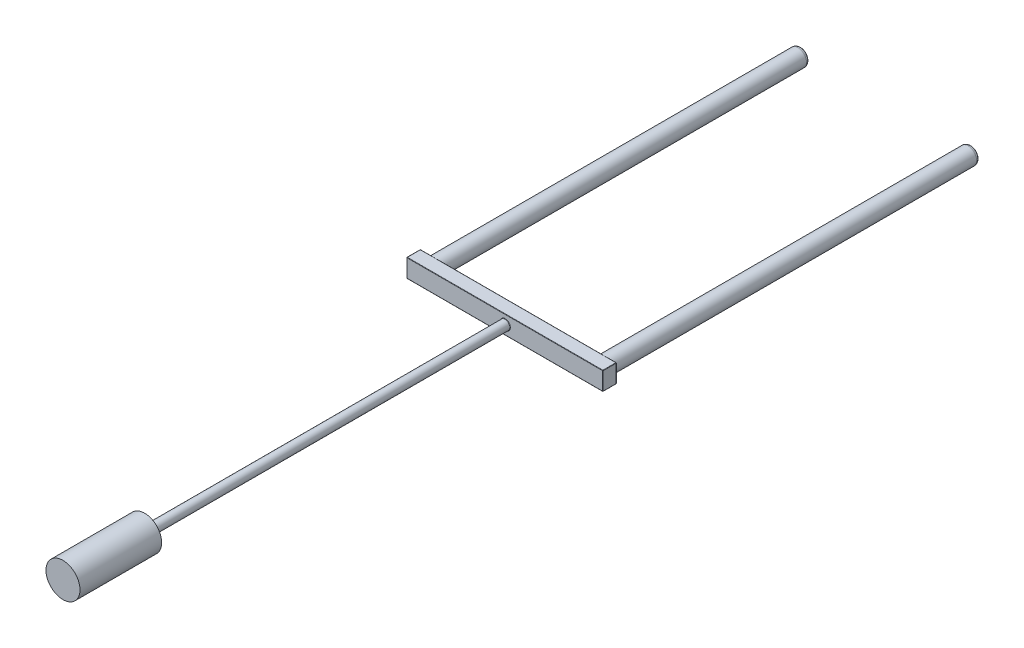
ISO-10303-21;
HEADER;
FILE_DESCRIPTION(('STEP AP214'),'2;1');
FILE_NAME('part.step','',(''),(''),'','','');
FILE_SCHEMA(('AUTOMOTIVE_DESIGN { 1 0 10303 214 1 1 1 1 }'));
ENDSEC;
DATA;
#1=APPLICATION_CONTEXT('core data for automotive mechanical design processes');
#2=APPLICATION_PROTOCOL_DEFINITION('international standard','automotive_design',2000,#1);
#3=PRODUCT_CONTEXT('',#1,'mechanical');
#4=PRODUCT('Part','Part','',(#3));
#5=PRODUCT_RELATED_PRODUCT_CATEGORY('part','',(#4));
#6=PRODUCT_DEFINITION_FORMATION('','',#4);
#7=PRODUCT_DEFINITION_CONTEXT('part definition',#1,'design');
#8=PRODUCT_DEFINITION('design','',#6,#7);
#9=PRODUCT_DEFINITION_SHAPE('','',#8);
#10=(LENGTH_UNIT() NAMED_UNIT(*) SI_UNIT(.MILLI.,.METRE.));
#11=(NAMED_UNIT(*) PLANE_ANGLE_UNIT() SI_UNIT($,.RADIAN.));
#12=(NAMED_UNIT(*) SI_UNIT($,.STERADIAN.) SOLID_ANGLE_UNIT());
#13=UNCERTAINTY_MEASURE_WITH_UNIT(LENGTH_MEASURE(1.E-05),#10,'distance_accuracy_value','');
#14=(GEOMETRIC_REPRESENTATION_CONTEXT(3) GLOBAL_UNCERTAINTY_ASSIGNED_CONTEXT((#13)) GLOBAL_UNIT_ASSIGNED_CONTEXT((#10,
#11,#12)) REPRESENTATION_CONTEXT('',''));
#15=CARTESIAN_POINT('',(0.,0.,0.));
#16=DIRECTION('',(0.,0.,1.));
#17=DIRECTION('',(1.,0.,0.));
#18=AXIS2_PLACEMENT_3D('',#15,#16,#17);
#19=CARTESIAN_POINT('',(0.,0.,-100.));
#20=DIRECTION('',(0.,0.,1.));
#21=DIRECTION('',(1.,0.,0.));
#22=AXIS2_PLACEMENT_3D('',#19,#20,#21);
#23=CYLINDRICAL_SURFACE('',#22,7.);
#24=CARTESIAN_POINT('',(0.,0.,-89.5));
#25=DIRECTION('',(0.,0.,-1.));
#26=DIRECTION('',(-1.,0.,0.));
#27=AXIS2_PLACEMENT_3D('',#24,#25,#26);
#28=CIRCLE('',#27,7.);
#29=CARTESIAN_POINT('',(-7.,0.,-89.5));
#30=VERTEX_POINT('',#29);
#31=EDGE_CURVE('E530',#30,#30,#28,.F.);
#32=ORIENTED_EDGE('',*,*,#31,.T.);
#33=EDGE_LOOP('',(#32));
#34=FACE_BOUND('',#33,.T.);
#35=CARTESIAN_POINT('',(0.,0.,440.));
#36=DIRECTION('',(0.,0.,1.));
#37=DIRECTION('',(1.,0.,0.));
#38=AXIS2_PLACEMENT_3D('',#35,#36,#37);
#39=CIRCLE('',#38,7.);
#40=CARTESIAN_POINT('',(7.,0.,440.));
#41=VERTEX_POINT('',#40);
#42=EDGE_CURVE('E49',#41,#41,#39,.F.);
#43=ORIENTED_EDGE('',*,*,#42,.T.);
#44=EDGE_LOOP('',(#43));
#45=FACE_BOUND('',#44,.T.);
#46=ADVANCED_FACE('F45',(#34,#45),#23,.T.);
#47=CARTESIAN_POINT('',(143.317708980683,13.2450015408682,-90.));
#48=DIRECTION('',(1.,0.,0.));
#49=DIRECTION('',(0.,0.,-1.));
#50=AXIS2_PLACEMENT_3D('',#47,#48,#49);
#51=PLANE('',#50);
#52=DIRECTION('',(0.,0.,-1.));
#53=VECTOR('',#52,1.);
#54=CARTESIAN_POINT('',(143.317708980683,12.7450015408682,-90.));
#55=LINE('',#54,#53);
#56=CARTESIAN_POINT('',(143.317708980683,12.7450015408682,-109.5));
#57=VERTEX_POINT('',#56);
#58=CARTESIAN_POINT('',(143.317708980683,12.7450015408682,-90.5));
#59=VERTEX_POINT('',#58);
#60=EDGE_CURVE('E173',#57,#59,#55,.F.);
#61=ORIENTED_EDGE('',*,*,#60,.T.);
#62=DIRECTION('',(0.,-1.,0.));
#63=VECTOR('',#62,1.);
#64=CARTESIAN_POINT('',(143.317708980683,-13.6978221063691,-90.5));
#65=LINE('',#64,#63);
#66=CARTESIAN_POINT('',(143.317708980683,-13.1978221063691,-90.5));
#67=VERTEX_POINT('',#66);
#68=EDGE_CURVE('E141',#59,#67,#65,.T.);
#69=ORIENTED_EDGE('',*,*,#68,.T.);
#70=DIRECTION('',(0.,0.,-1.));
#71=VECTOR('',#70,1.);
#72=CARTESIAN_POINT('',(143.317708980683,-13.1978221063691,-90.));
#73=LINE('',#72,#71);
#74=CARTESIAN_POINT('',(143.317708980683,-13.1978221063691,-109.5));
#75=VERTEX_POINT('',#74);
#76=EDGE_CURVE('E161',#67,#75,#73,.T.);
#77=ORIENTED_EDGE('',*,*,#76,.T.);
#78=DIRECTION('',(0.,-1.,0.));
#79=VECTOR('',#78,1.);
#80=CARTESIAN_POINT('',(143.317708980683,13.2450015408682,-109.5));
#81=LINE('',#80,#79);
#82=EDGE_CURVE('E168',#75,#57,#81,.F.);
#83=ORIENTED_EDGE('',*,*,#82,.T.);
#84=EDGE_LOOP('',(#61,#69,#77,#83));
#85=FACE_BOUND('',#84,.T.);
#86=ADVANCED_FACE('F171',(#85),#51,.T.);
#87=CARTESIAN_POINT('',(143.317708980683,13.2450015408682,-90.));
#88=DIRECTION('',(0.,1.,0.));
#89=DIRECTION('',(0.,0.,1.));
#90=AXIS2_PLACEMENT_3D('',#87,#88,#89);
#91=PLANE('',#90);
#92=DIRECTION('',(0.,0.,-1.));
#93=VECTOR('',#92,1.);
#94=CARTESIAN_POINT('',(-144.402580959932,13.2450015408682,-90.));
#95=LINE('',#94,#93);
#96=CARTESIAN_POINT('',(-144.402580959932,13.2450015408682,-109.5));
#97=VERTEX_POINT('',#96);
#98=CARTESIAN_POINT('',(-144.402580959932,13.2450015408682,-90.5));
#99=VERTEX_POINT('',#98);
#100=EDGE_CURVE('E195',#97,#99,#95,.F.);
#101=ORIENTED_EDGE('',*,*,#100,.T.);
#102=DIRECTION('',(1.,0.,0.));
#103=VECTOR('',#102,1.);
#104=CARTESIAN_POINT('',(143.317708980683,13.2450015408682,-90.5));
#105=LINE('',#104,#103);
#106=CARTESIAN_POINT('',(142.817708980683,13.2450015408682,-90.5));
#107=VERTEX_POINT('',#106);
#108=EDGE_CURVE('E202',#99,#107,#105,.T.);
#109=ORIENTED_EDGE('',*,*,#108,.T.);
#110=DIRECTION('',(0.,0.,-1.));
#111=VECTOR('',#110,1.);
#112=CARTESIAN_POINT('',(142.817708980683,13.2450015408682,-90.));
#113=LINE('',#112,#111);
#114=CARTESIAN_POINT('',(142.817708980683,13.2450015408682,-109.5));
#115=VERTEX_POINT('',#114);
#116=EDGE_CURVE('E198',#107,#115,#113,.T.);
#117=ORIENTED_EDGE('',*,*,#116,.T.);
#118=DIRECTION('',(1.,0.,0.));
#119=VECTOR('',#118,1.);
#120=CARTESIAN_POINT('',(143.317708980683,13.2450015408682,-109.5));
#121=LINE('',#120,#119);
#122=EDGE_CURVE('E192',#115,#97,#121,.F.);
#123=ORIENTED_EDGE('',*,*,#122,.T.);
#124=EDGE_LOOP('',(#101,#109,#117,#123));
#125=FACE_BOUND('',#124,.T.);
#126=ADVANCED_FACE('F354',(#125),#91,.T.);
#127=CARTESIAN_POINT('',(-144.902580959932,13.2450015408682,-90.));
#128=DIRECTION('',(-1.,0.,0.));
#129=DIRECTION('',(0.,0.,1.));
#130=AXIS2_PLACEMENT_3D('',#127,#128,#129);
#131=PLANE('',#130);
#132=DIRECTION('',(0.,0.,-1.));
#133=VECTOR('',#132,1.);
#134=CARTESIAN_POINT('',(-144.902580959932,-13.1978221063691,-90.));
#135=LINE('',#134,#133);
#136=CARTESIAN_POINT('',(-144.902580959932,-13.1978221063691,-109.5));
#137=VERTEX_POINT('',#136);
#138=CARTESIAN_POINT('',(-144.902580959932,-13.1978221063691,-90.5));
#139=VERTEX_POINT('',#138);
#140=EDGE_CURVE('E62',#137,#139,#135,.F.);
#141=ORIENTED_EDGE('',*,*,#140,.T.);
#142=DIRECTION('',(0.,1.,0.));
#143=VECTOR('',#142,1.);
#144=CARTESIAN_POINT('',(-144.902580959932,13.2450015408682,-90.5));
#145=LINE('',#144,#143);
#146=CARTESIAN_POINT('',(-144.902580959932,12.7450015408682,-90.5));
#147=VERTEX_POINT('',#146);
#148=EDGE_CURVE('E238',#139,#147,#145,.T.);
#149=ORIENTED_EDGE('',*,*,#148,.T.);
#150=DIRECTION('',(0.,0.,-1.));
#151=VECTOR('',#150,1.);
#152=CARTESIAN_POINT('',(-144.902580959932,12.7450015408682,-90.));
#153=LINE('',#152,#151);
#154=CARTESIAN_POINT('',(-144.902580959932,12.7450015408682,-109.5));
#155=VERTEX_POINT('',#154);
#156=EDGE_CURVE('E231',#147,#155,#153,.T.);
#157=ORIENTED_EDGE('',*,*,#156,.T.);
#158=DIRECTION('',(0.,1.,0.));
#159=VECTOR('',#158,1.);
#160=CARTESIAN_POINT('',(-144.902580959932,13.2450015408682,-109.5));
#161=LINE('',#160,#159);
#162=EDGE_CURVE('E67',#155,#137,#161,.F.);
#163=ORIENTED_EDGE('',*,*,#162,.T.);
#164=EDGE_LOOP('',(#141,#149,#157,#163));
#165=FACE_BOUND('',#164,.T.);
#166=ADVANCED_FACE('F469',(#165),#131,.T.);
#167=CARTESIAN_POINT('',(143.317708980683,-13.6978221063691,-90.));
#168=DIRECTION('',(0.,-1.,0.));
#169=DIRECTION('',(0.,0.,-1.));
#170=AXIS2_PLACEMENT_3D('',#167,#168,#169);
#171=PLANE('',#170);
#172=DIRECTION('',(0.,0.,-1.));
#173=VECTOR('',#172,1.);
#174=CARTESIAN_POINT('',(142.817708980683,-13.6978221063691,-90.));
#175=LINE('',#174,#173);
#176=CARTESIAN_POINT('',(142.817708980683,-13.6978221063691,-109.5));
#177=VERTEX_POINT('',#176);
#178=CARTESIAN_POINT('',(142.817708980683,-13.6978221063691,-90.5));
#179=VERTEX_POINT('',#178);
#180=EDGE_CURVE('E224',#177,#179,#175,.F.);
#181=ORIENTED_EDGE('',*,*,#180,.T.);
#182=DIRECTION('',(-1.,0.,0.));
#183=VECTOR('',#182,1.);
#184=CARTESIAN_POINT('',(-144.902580959932,-13.6978221063691,-90.5));
#185=LINE('',#184,#183);
#186=CARTESIAN_POINT('',(-144.402580959932,-13.6978221063691,-90.5));
#187=VERTEX_POINT('',#186);
#188=EDGE_CURVE('E228',#179,#187,#185,.T.);
#189=ORIENTED_EDGE('',*,*,#188,.T.);
#190=DIRECTION('',(0.,0.,-1.));
#191=VECTOR('',#190,1.);
#192=CARTESIAN_POINT('',(-144.402580959932,-13.6978221063691,-90.));
#193=LINE('',#192,#191);
#194=CARTESIAN_POINT('',(-144.402580959932,-13.6978221063691,-109.5));
#195=VERTEX_POINT('',#194);
#196=EDGE_CURVE('E221',#187,#195,#193,.T.);
#197=ORIENTED_EDGE('',*,*,#196,.T.);
#198=DIRECTION('',(-1.,0.,0.));
#199=VECTOR('',#198,1.);
#200=CARTESIAN_POINT('',(143.317708980683,-13.6978221063691,-109.5));
#201=LINE('',#200,#199);
#202=EDGE_CURVE('E218',#195,#177,#201,.F.);
#203=ORIENTED_EDGE('',*,*,#202,.T.);
#204=EDGE_LOOP('',(#181,#189,#197,#203));
#205=FACE_BOUND('',#204,.T.);
#206=ADVANCED_FACE('F482',(#205),#171,.T.);
#207=CARTESIAN_POINT('',(0.,0.,-90.));
#208=DIRECTION('',(0.,0.,-1.));
#209=DIRECTION('',(-1.,0.,0.));
#210=AXIS2_PLACEMENT_3D('',#207,#208,#209);
#211=PLANE('',#210);
#212=DIRECTION('',(0.,-1.,0.));
#213=VECTOR('',#212,1.);
#214=CARTESIAN_POINT('',(142.817708980683,13.2450015408682,-90.));
#215=LINE('',#214,#213);
#216=CARTESIAN_POINT('',(142.817708980683,-13.1978221063691,-90.));
#217=VERTEX_POINT('',#216);
#218=CARTESIAN_POINT('',(142.817708980683,12.7450015408682,-90.));
#219=VERTEX_POINT('',#218);
#220=EDGE_CURVE('E143',#217,#219,#215,.F.);
#221=ORIENTED_EDGE('',*,*,#220,.T.);
#222=DIRECTION('',(1.,0.,0.));
#223=VECTOR('',#222,1.);
#224=CARTESIAN_POINT('',(-144.902580959932,12.7450015408682,-90.));
#225=LINE('',#224,#223);
#226=CARTESIAN_POINT('',(-144.402580959932,12.7450015408682,-90.));
#227=VERTEX_POINT('',#226);
#228=EDGE_CURVE('E189',#219,#227,#225,.F.);
#229=ORIENTED_EDGE('',*,*,#228,.T.);
#230=DIRECTION('',(0.,1.,0.));
#231=VECTOR('',#230,1.);
#232=CARTESIAN_POINT('',(-144.402580959932,-13.6978221063691,-90.));
#233=LINE('',#232,#231);
#234=CARTESIAN_POINT('',(-144.402580959932,-13.1978221063691,-90.));
#235=VERTEX_POINT('',#234);
#236=EDGE_CURVE('E180',#227,#235,#233,.F.);
#237=ORIENTED_EDGE('',*,*,#236,.T.);
#238=DIRECTION('',(-1.,0.,0.));
#239=VECTOR('',#238,1.);
#240=CARTESIAN_POINT('',(143.317708980683,-13.1978221063691,-90.));
#241=LINE('',#240,#239);
#242=EDGE_CURVE('E176',#235,#217,#241,.F.);
#243=ORIENTED_EDGE('',*,*,#242,.T.);
#244=EDGE_LOOP('',(#221,#229,#237,#243));
#245=FACE_BOUND('',#244,.T.);
#246=CARTESIAN_POINT('',(0.,0.,-90.));
#247=DIRECTION('',(0.,0.,-1.));
#248=DIRECTION('',(-1.,0.,0.));
#249=AXIS2_PLACEMENT_3D('',#246,#247,#248);
#250=CIRCLE('',#249,7.5);
#251=CARTESIAN_POINT('',(-7.5,0.,-90.));
#252=VERTEX_POINT('',#251);
#253=EDGE_CURVE('E169',#252,#252,#250,.T.);
#254=ORIENTED_EDGE('',*,*,#253,.T.);
#255=EDGE_LOOP('',(#254));
#256=FACE_BOUND('',#255,.T.);
#257=ADVANCED_FACE('F479',(#245,#256),#211,.F.);
#258=CARTESIAN_POINT('',(0.,0.,-110.));
#259=DIRECTION('',(0.,0.,-1.));
#260=DIRECTION('',(-1.,0.,0.));
#261=AXIS2_PLACEMENT_3D('',#258,#259,#260);
#262=PLANE('',#261);
#263=DIRECTION('',(0.,1.,0.));
#264=VECTOR('',#263,1.);
#265=CARTESIAN_POINT('',(-144.402580959932,0.,-110.));
#266=LINE('',#265,#264);
#267=CARTESIAN_POINT('',(-144.402580959932,-13.1978221063691,-110.));
#268=VERTEX_POINT('',#267);
#269=CARTESIAN_POINT('',(-144.402580959932,12.7450015408682,-110.));
#270=VERTEX_POINT('',#269);
#271=EDGE_CURVE('E208',#268,#270,#266,.T.);
#272=ORIENTED_EDGE('',*,*,#271,.T.);
#273=DIRECTION('',(1.,0.,0.));
#274=VECTOR('',#273,1.);
#275=CARTESIAN_POINT('',(0.,12.7450015408682,-110.));
#276=LINE('',#275,#274);
#277=CARTESIAN_POINT('',(142.817708980683,12.7450015408682,-110.));
#278=VERTEX_POINT('',#277);
#279=EDGE_CURVE('E215',#270,#278,#276,.T.);
#280=ORIENTED_EDGE('',*,*,#279,.T.);
#281=DIRECTION('',(0.,-1.,0.));
#282=VECTOR('',#281,1.);
#283=CARTESIAN_POINT('',(142.817708980683,0.,-110.));
#284=LINE('',#283,#282);
#285=CARTESIAN_POINT('',(142.817708980683,-13.1978221063691,-110.));
#286=VERTEX_POINT('',#285);
#287=EDGE_CURVE('E211',#278,#286,#284,.T.);
#288=ORIENTED_EDGE('',*,*,#287,.T.);
#289=DIRECTION('',(-1.,0.,0.));
#290=VECTOR('',#289,1.);
#291=CARTESIAN_POINT('',(0.,-13.1978221063691,-110.));
#292=LINE('',#291,#290);
#293=EDGE_CURVE('E205',#286,#268,#292,.T.);
#294=ORIENTED_EDGE('',*,*,#293,.T.);
#295=EDGE_LOOP('',(#272,#280,#288,#294));
#296=FACE_BOUND('',#295,.T.);
#297=CARTESIAN_POINT('',(125.,0.,-110.));
#298=DIRECTION('',(0.,0.,-1.));
#299=DIRECTION('',(-1.,0.,0.));
#300=AXIS2_PLACEMENT_3D('',#297,#298,#299);
#301=CIRCLE('',#300,12.5);
#302=CARTESIAN_POINT('',(112.5,0.,-110.));
#303=VERTEX_POINT('',#302);
#304=EDGE_CURVE('E320',#303,#303,#301,.F.);
#305=ORIENTED_EDGE('',*,*,#304,.T.);
#306=EDGE_LOOP('',(#305));
#307=FACE_BOUND('',#306,.T.);
#308=CARTESIAN_POINT('',(-125.,0.,-110.));
#309=DIRECTION('',(0.,0.,-1.));
#310=DIRECTION('',(-1.,0.,0.));
#311=AXIS2_PLACEMENT_3D('',#308,#309,#310);
#312=CIRCLE('',#311,12.5);
#313=CARTESIAN_POINT('',(-137.5,0.,-110.));
#314=VERTEX_POINT('',#313);
#315=EDGE_CURVE('E526',#314,#314,#312,.F.);
#316=ORIENTED_EDGE('',*,*,#315,.T.);
#317=EDGE_LOOP('',(#316));
#318=FACE_BOUND('',#317,.T.);
#319=ADVANCED_FACE('F451',(#296,#307,#318),#262,.T.);
#320=CARTESIAN_POINT('',(-125.,0.,-100.));
#321=DIRECTION('',(0.,0.,-1.));
#322=DIRECTION('',(-1.,0.,0.));
#323=AXIS2_PLACEMENT_3D('',#320,#321,#322);
#324=CYLINDRICAL_SURFACE('',#323,12.5);
#325=CARTESIAN_POINT('',(-125.,0.,-645.));
#326=DIRECTION('',(0.,0.,1.));
#327=DIRECTION('',(1.,0.,0.));
#328=AXIS2_PLACEMENT_3D('',#325,#326,#327);
#329=CIRCLE('',#328,12.5);
#330=CARTESIAN_POINT('',(-112.5,0.,-645.));
#331=VERTEX_POINT('',#330);
#332=EDGE_CURVE('E240',#331,#331,#329,.T.);
#333=ORIENTED_EDGE('',*,*,#332,.T.);
#334=EDGE_LOOP('',(#333));
#335=FACE_BOUND('',#334,.T.);
#336=ORIENTED_EDGE('',*,*,#315,.F.);
#337=EDGE_LOOP('',(#336));
#338=FACE_BOUND('',#337,.T.);
#339=ADVANCED_FACE('F494',(#335,#338),#324,.T.);
#340=CARTESIAN_POINT('',(-125.,0.,-650.));
#341=DIRECTION('',(0.,0.,1.));
#342=DIRECTION('',(1.,0.,0.));
#343=AXIS2_PLACEMENT_3D('',#340,#341,#342);
#344=PLANE('',#343);
#345=CARTESIAN_POINT('',(-125.,0.,-650.));
#346=DIRECTION('',(0.,0.,1.));
#347=DIRECTION('',(1.,0.,0.));
#348=AXIS2_PLACEMENT_3D('',#345,#346,#347);
#349=CIRCLE('',#348,7.5);
#350=CARTESIAN_POINT('',(-117.5,0.,-650.));
#351=VERTEX_POINT('',#350);
#352=EDGE_CURVE('E324',#351,#351,#349,.F.);
#353=ORIENTED_EDGE('',*,*,#352,.T.);
#354=EDGE_LOOP('',(#353));
#355=FACE_BOUND('',#354,.T.);
#356=ADVANCED_FACE('F497',(#355),#344,.F.);
#357=CARTESIAN_POINT('',(125.,0.,-100.));
#358=DIRECTION('',(0.,0.,-1.));
#359=DIRECTION('',(-1.,0.,0.));
#360=AXIS2_PLACEMENT_3D('',#357,#358,#359);
#361=CYLINDRICAL_SURFACE('',#360,12.5);
#362=CARTESIAN_POINT('',(125.,0.,-645.));
#363=DIRECTION('',(0.,0.,1.));
#364=DIRECTION('',(1.,0.,0.));
#365=AXIS2_PLACEMENT_3D('',#362,#363,#364);
#366=CIRCLE('',#365,12.5);
#367=CARTESIAN_POINT('',(137.5,0.,-645.));
#368=VERTEX_POINT('',#367);
#369=EDGE_CURVE('E55',#368,#368,#366,.T.);
#370=ORIENTED_EDGE('',*,*,#369,.T.);
#371=EDGE_LOOP('',(#370));
#372=FACE_BOUND('',#371,.T.);
#373=ORIENTED_EDGE('',*,*,#304,.F.);
#374=EDGE_LOOP('',(#373));
#375=FACE_BOUND('',#374,.T.);
#376=ADVANCED_FACE('F332',(#372,#375),#361,.T.);
#377=CARTESIAN_POINT('',(125.,0.,-650.));
#378=DIRECTION('',(0.,0.,1.));
#379=DIRECTION('',(1.,0.,0.));
#380=AXIS2_PLACEMENT_3D('',#377,#378,#379);
#381=PLANE('',#380);
#382=CARTESIAN_POINT('',(125.,0.,-650.));
#383=DIRECTION('',(0.,0.,1.));
#384=DIRECTION('',(1.,0.,0.));
#385=AXIS2_PLACEMENT_3D('',#382,#383,#384);
#386=CIRCLE('',#385,7.49999999999999);
#387=CARTESIAN_POINT('',(132.5,0.,-650.));
#388=VERTEX_POINT('',#387);
#389=EDGE_CURVE('E11',#388,#388,#386,.F.);
#390=ORIENTED_EDGE('',*,*,#389,.T.);
#391=EDGE_LOOP('',(#390));
#392=FACE_BOUND('',#391,.T.);
#393=ADVANCED_FACE('F364',(#392),#381,.F.);
#394=CARTESIAN_POINT('',(0.,0.,-89.5));
#395=DIRECTION('',(0.,0.,-1.));
#396=DIRECTION('',(-1.,0.,0.));
#397=AXIS2_PLACEMENT_3D('',#394,#395,#396);
#398=TOROIDAL_SURFACE('',#397,7.5,0.5);
#399=ORIENTED_EDGE('',*,*,#253,.F.);
#400=EDGE_LOOP('',(#399));
#401=FACE_BOUND('',#400,.T.);
#402=ORIENTED_EDGE('',*,*,#31,.F.);
#403=EDGE_LOOP('',(#402));
#404=FACE_BOUND('',#403,.T.);
#405=ADVANCED_FACE('F360',(#401,#404),#398,.F.);
#406=CARTESIAN_POINT('',(-144.402580959932,0.,-109.5));
#407=DIRECTION('',(0.,1.,0.));
#408=DIRECTION('',(0.,0.,1.));
#409=AXIS2_PLACEMENT_3D('',#406,#407,#408);
#410=CYLINDRICAL_SURFACE('',#409,0.5);
#411=CARTESIAN_POINT('',(-144.402580959932,12.7450015408682,-109.5));
#412=DIRECTION('',(0.,1.,0.));
#413=DIRECTION('',(0.,0.,1.));
#414=AXIS2_PLACEMENT_3D('',#411,#412,#413);
#415=CIRCLE('',#414,0.5);
#416=EDGE_CURVE('E316',#270,#155,#415,.T.);
#417=ORIENTED_EDGE('',*,*,#416,.F.);
#418=ORIENTED_EDGE('',*,*,#271,.F.);
#419=CARTESIAN_POINT('',(-144.402580959932,-13.1978221063691,-109.5));
#420=DIRECTION('',(0.,-1.,0.));
#421=DIRECTION('',(0.,0.,-1.));
#422=AXIS2_PLACEMENT_3D('',#419,#420,#421);
#423=CIRCLE('',#422,0.5);
#424=EDGE_CURVE('E312',#137,#268,#423,.T.);
#425=ORIENTED_EDGE('',*,*,#424,.F.);
#426=ORIENTED_EDGE('',*,*,#162,.F.);
#427=EDGE_LOOP('',(#417,#418,#425,#426));
#428=FACE_BOUND('',#427,.T.);
#429=ADVANCED_FACE('F363',(#428),#410,.T.);
#430=CARTESIAN_POINT('',(-144.402580959932,12.7450015408682,-109.5));
#431=DIRECTION('',(-1.,0.,0.));
#432=DIRECTION('',(0.,0.,1.));
#433=AXIS2_PLACEMENT_3D('',#430,#431,#432);
#434=SPHERICAL_SURFACE('',#433,0.5);
#435=CARTESIAN_POINT('',(-144.402580959932,12.7450015408682,-109.5));
#436=DIRECTION('',(-1.,0.,0.));
#437=DIRECTION('',(0.,0.,1.));
#438=AXIS2_PLACEMENT_3D('',#435,#436,#437);
#439=CIRCLE('',#438,0.5);
#440=EDGE_CURVE('E304',#270,#97,#439,.F.);
#441=ORIENTED_EDGE('',*,*,#440,.F.);
#442=ORIENTED_EDGE('',*,*,#416,.T.);
#443=CARTESIAN_POINT('',(-144.402580959932,12.7450015408682,-109.5));
#444=DIRECTION('',(0.,0.,-1.));
#445=DIRECTION('',(-1.,0.,0.));
#446=AXIS2_PLACEMENT_3D('',#443,#444,#445);
#447=CIRCLE('',#446,0.5);
#448=EDGE_CURVE('E308',#97,#155,#447,.F.);
#449=ORIENTED_EDGE('',*,*,#448,.F.);
#450=EDGE_LOOP('',(#441,#442,#449));
#451=FACE_BOUND('',#450,.T.);
#452=ADVANCED_FACE('F431',(#451),#434,.T.);
#453=CARTESIAN_POINT('',(-144.402580959932,-13.1978221063691,-109.5));
#454=DIRECTION('',(0.,0.,-1.));
#455=DIRECTION('',(-1.,0.,0.));
#456=AXIS2_PLACEMENT_3D('',#453,#454,#455);
#457=SPHERICAL_SURFACE('',#456,0.5);
#458=CARTESIAN_POINT('',(-144.402580959932,-13.1978221063691,-109.5));
#459=DIRECTION('',(0.,0.,-1.));
#460=DIRECTION('',(-1.,0.,0.));
#461=AXIS2_PLACEMENT_3D('',#458,#459,#460);
#462=CIRCLE('',#461,0.5);
#463=EDGE_CURVE('E296',#137,#195,#462,.F.);
#464=ORIENTED_EDGE('',*,*,#463,.F.);
#465=ORIENTED_EDGE('',*,*,#424,.T.);
#466=CARTESIAN_POINT('',(-144.402580959932,-13.1978221063691,-109.5));
#467=DIRECTION('',(-1.,0.,0.));
#468=DIRECTION('',(0.,-1.,0.));
#469=AXIS2_PLACEMENT_3D('',#466,#467,#468);
#470=CIRCLE('',#469,0.5);
#471=EDGE_CURVE('E300',#195,#268,#470,.F.);
#472=ORIENTED_EDGE('',*,*,#471,.F.);
#473=EDGE_LOOP('',(#464,#465,#472));
#474=FACE_BOUND('',#473,.T.);
#475=ADVANCED_FACE('F427',(#474),#457,.T.);
#476=CARTESIAN_POINT('',(-144.402580959932,12.7450015408682,-90.));
#477=DIRECTION('',(0.,0.,-1.));
#478=DIRECTION('',(-1.,0.,0.));
#479=AXIS2_PLACEMENT_3D('',#476,#477,#478);
#480=CYLINDRICAL_SURFACE('',#479,0.5);
#481=ORIENTED_EDGE('',*,*,#448,.T.);
#482=ORIENTED_EDGE('',*,*,#156,.F.);
#483=CARTESIAN_POINT('',(-144.402580959932,12.7450015408682,-90.5));
#484=DIRECTION('',(0.,0.,1.));
#485=DIRECTION('',(1.,0.,0.));
#486=AXIS2_PLACEMENT_3D('',#483,#484,#485);
#487=CIRCLE('',#486,0.5);
#488=EDGE_CURVE('E289',#99,#147,#487,.T.);
#489=ORIENTED_EDGE('',*,*,#488,.F.);
#490=ORIENTED_EDGE('',*,*,#100,.F.);
#491=EDGE_LOOP('',(#481,#482,#489,#490));
#492=FACE_BOUND('',#491,.T.);
#493=ADVANCED_FACE('F423',(#492),#480,.T.);
#494=CARTESIAN_POINT('',(0.,12.7450015408682,-109.5));
#495=DIRECTION('',(1.,0.,0.));
#496=DIRECTION('',(0.,0.,-1.));
#497=AXIS2_PLACEMENT_3D('',#494,#495,#496);
#498=CYLINDRICAL_SURFACE('',#497,0.5);
#499=ORIENTED_EDGE('',*,*,#440,.T.);
#500=ORIENTED_EDGE('',*,*,#122,.F.);
#501=CARTESIAN_POINT('',(142.817708980683,12.7450015408682,-109.5));
#502=DIRECTION('',(1.,0.,0.));
#503=DIRECTION('',(0.,0.,-1.));
#504=AXIS2_PLACEMENT_3D('',#501,#502,#503);
#505=CIRCLE('',#504,0.5);
#506=EDGE_CURVE('E285',#278,#115,#505,.T.);
#507=ORIENTED_EDGE('',*,*,#506,.F.);
#508=ORIENTED_EDGE('',*,*,#279,.F.);
#509=EDGE_LOOP('',(#499,#500,#507,#508));
#510=FACE_BOUND('',#509,.T.);
#511=ADVANCED_FACE('F419',(#510),#498,.T.);
#512=CARTESIAN_POINT('',(142.817708980683,0.,-109.5));
#513=DIRECTION('',(0.,-1.,0.));
#514=DIRECTION('',(0.,0.,-1.));
#515=AXIS2_PLACEMENT_3D('',#512,#513,#514);
#516=CYLINDRICAL_SURFACE('',#515,0.5);
#517=CARTESIAN_POINT('',(142.817708980683,-13.1978221063691,-109.5));
#518=DIRECTION('',(0.,-1.,0.));
#519=DIRECTION('',(0.,0.,-1.));
#520=AXIS2_PLACEMENT_3D('',#517,#518,#519);
#521=CIRCLE('',#520,0.5);
#522=EDGE_CURVE('E277',#286,#75,#521,.T.);
#523=ORIENTED_EDGE('',*,*,#522,.F.);
#524=ORIENTED_EDGE('',*,*,#287,.F.);
#525=CARTESIAN_POINT('',(142.817708980683,12.7450015408682,-109.5));
#526=DIRECTION('',(0.,1.,0.));
#527=DIRECTION('',(0.,0.,1.));
#528=AXIS2_PLACEMENT_3D('',#525,#526,#527);
#529=CIRCLE('',#528,0.5);
#530=EDGE_CURVE('E281',#57,#278,#529,.T.);
#531=ORIENTED_EDGE('',*,*,#530,.F.);
#532=ORIENTED_EDGE('',*,*,#82,.F.);
#533=EDGE_LOOP('',(#523,#524,#531,#532));
#534=FACE_BOUND('',#533,.T.);
#535=ADVANCED_FACE('F415',(#534),#516,.T.);
#536=CARTESIAN_POINT('',(0.,-13.1978221063691,-109.5));
#537=DIRECTION('',(-1.,0.,0.));
#538=DIRECTION('',(0.,0.,1.));
#539=AXIS2_PLACEMENT_3D('',#536,#537,#538);
#540=CYLINDRICAL_SURFACE('',#539,0.5);
#541=ORIENTED_EDGE('',*,*,#471,.T.);
#542=ORIENTED_EDGE('',*,*,#293,.F.);
#543=CARTESIAN_POINT('',(142.817708980683,-13.1978221063691,-109.5));
#544=DIRECTION('',(1.,0.,0.));
#545=DIRECTION('',(0.,0.,-1.));
#546=AXIS2_PLACEMENT_3D('',#543,#544,#545);
#547=CIRCLE('',#546,0.5);
#548=EDGE_CURVE('E274',#177,#286,#547,.T.);
#549=ORIENTED_EDGE('',*,*,#548,.F.);
#550=ORIENTED_EDGE('',*,*,#202,.F.);
#551=EDGE_LOOP('',(#541,#542,#549,#550));
#552=FACE_BOUND('',#551,.T.);
#553=ADVANCED_FACE('F411',(#552),#540,.T.);
#554=CARTESIAN_POINT('',(-144.402580959932,-13.1978221063691,-90.));
#555=DIRECTION('',(0.,0.,-1.));
#556=DIRECTION('',(-1.,0.,0.));
#557=AXIS2_PLACEMENT_3D('',#554,#555,#556);
#558=CYLINDRICAL_SURFACE('',#557,0.5);
#559=ORIENTED_EDGE('',*,*,#463,.T.);
#560=ORIENTED_EDGE('',*,*,#196,.F.);
#561=CARTESIAN_POINT('',(-144.402580959932,-13.1978221063691,-90.5));
#562=DIRECTION('',(0.,0.,1.));
#563=DIRECTION('',(1.,0.,0.));
#564=AXIS2_PLACEMENT_3D('',#561,#562,#563);
#565=CIRCLE('',#564,0.5);
#566=EDGE_CURVE('E270',#139,#187,#565,.T.);
#567=ORIENTED_EDGE('',*,*,#566,.F.);
#568=ORIENTED_EDGE('',*,*,#140,.F.);
#569=EDGE_LOOP('',(#559,#560,#567,#568));
#570=FACE_BOUND('',#569,.T.);
#571=ADVANCED_FACE('F407',(#570),#558,.T.);
#572=CARTESIAN_POINT('',(-144.402580959932,13.2450015408682,-90.5));
#573=DIRECTION('',(0.,-1.,0.));
#574=DIRECTION('',(0.,0.,-1.));
#575=AXIS2_PLACEMENT_3D('',#572,#573,#574);
#576=CYLINDRICAL_SURFACE('',#575,0.5);
#577=CARTESIAN_POINT('',(-144.402580959932,12.7450015408682,-90.5));
#578=DIRECTION('',(0.,1.,0.));
#579=DIRECTION('',(0.,0.,1.));
#580=AXIS2_PLACEMENT_3D('',#577,#578,#579);
#581=CIRCLE('',#580,0.5);
#582=EDGE_CURVE('E292',#147,#227,#581,.T.);
#583=ORIENTED_EDGE('',*,*,#582,.F.);
#584=ORIENTED_EDGE('',*,*,#148,.F.);
#585=CARTESIAN_POINT('',(-144.402580959932,-13.1978221063691,-90.5));
#586=DIRECTION('',(0.,-1.,0.));
#587=DIRECTION('',(0.,0.,-1.));
#588=AXIS2_PLACEMENT_3D('',#585,#586,#587);
#589=CIRCLE('',#588,0.5);
#590=EDGE_CURVE('E266',#235,#139,#589,.T.);
#591=ORIENTED_EDGE('',*,*,#590,.F.);
#592=ORIENTED_EDGE('',*,*,#236,.F.);
#593=EDGE_LOOP('',(#583,#584,#591,#592));
#594=FACE_BOUND('',#593,.T.);
#595=ADVANCED_FACE('F403',(#594),#576,.T.);
#596=CARTESIAN_POINT('',(-144.402580959932,12.7450015408682,-90.5));
#597=DIRECTION('',(-1.,0.,0.));
#598=DIRECTION('',(0.,0.,1.));
#599=AXIS2_PLACEMENT_3D('',#596,#597,#598);
#600=SPHERICAL_SURFACE('',#599,0.5);
#601=ORIENTED_EDGE('',*,*,#488,.T.);
#602=ORIENTED_EDGE('',*,*,#582,.T.);
#603=CARTESIAN_POINT('',(-144.402580959932,12.7450015408682,-90.5));
#604=DIRECTION('',(-1.,0.,0.));
#605=DIRECTION('',(0.,0.,1.));
#606=AXIS2_PLACEMENT_3D('',#603,#604,#605);
#607=CIRCLE('',#606,0.5);
#608=EDGE_CURVE('E262',#99,#227,#607,.F.);
#609=ORIENTED_EDGE('',*,*,#608,.F.);
#610=EDGE_LOOP('',(#601,#602,#609));
#611=FACE_BOUND('',#610,.T.);
#612=ADVANCED_FACE('F399',(#611),#600,.T.);
#613=CARTESIAN_POINT('',(142.817708980683,12.7450015408682,-109.5));
#614=DIRECTION('',(0.,0.,-1.));
#615=DIRECTION('',(-1.,0.,0.));
#616=AXIS2_PLACEMENT_3D('',#613,#614,#615);
#617=SPHERICAL_SURFACE('',#616,0.5);
#618=ORIENTED_EDGE('',*,*,#530,.T.);
#619=ORIENTED_EDGE('',*,*,#506,.T.);
#620=CARTESIAN_POINT('',(142.817708980683,12.7450015408682,-109.5));
#621=DIRECTION('',(0.,0.,-1.));
#622=DIRECTION('',(-1.,0.,0.));
#623=AXIS2_PLACEMENT_3D('',#620,#621,#622);
#624=CIRCLE('',#623,0.5);
#625=EDGE_CURVE('E259',#57,#115,#624,.F.);
#626=ORIENTED_EDGE('',*,*,#625,.F.);
#627=EDGE_LOOP('',(#618,#619,#626));
#628=FACE_BOUND('',#627,.T.);
#629=ADVANCED_FACE('F395',(#628),#617,.T.);
#630=CARTESIAN_POINT('',(142.817708980683,-13.1978221063691,-109.5));
#631=DIRECTION('',(0.,0.,-1.));
#632=DIRECTION('',(-1.,0.,0.));
#633=AXIS2_PLACEMENT_3D('',#630,#631,#632);
#634=SPHERICAL_SURFACE('',#633,0.5);
#635=ORIENTED_EDGE('',*,*,#548,.T.);
#636=ORIENTED_EDGE('',*,*,#522,.T.);
#637=CARTESIAN_POINT('',(142.817708980683,-13.1978221063691,-109.5));
#638=DIRECTION('',(0.,0.,-1.));
#639=DIRECTION('',(-1.,0.,0.));
#640=AXIS2_PLACEMENT_3D('',#637,#638,#639);
#641=CIRCLE('',#640,0.5);
#642=EDGE_CURVE('E164',#177,#75,#641,.F.);
#643=ORIENTED_EDGE('',*,*,#642,.F.);
#644=EDGE_LOOP('',(#635,#636,#643));
#645=FACE_BOUND('',#644,.T.);
#646=ADVANCED_FACE('F391',(#645),#634,.T.);
#647=CARTESIAN_POINT('',(-144.402580959932,-13.1978221063691,-90.5));
#648=DIRECTION('',(-1.,0.,0.));
#649=DIRECTION('',(0.,0.,1.));
#650=AXIS2_PLACEMENT_3D('',#647,#648,#649);
#651=SPHERICAL_SURFACE('',#650,0.5);
#652=ORIENTED_EDGE('',*,*,#590,.T.);
#653=ORIENTED_EDGE('',*,*,#566,.T.);
#654=CARTESIAN_POINT('',(-144.402580959932,-13.1978221063691,-90.5));
#655=DIRECTION('',(-1.,0.,0.));
#656=DIRECTION('',(0.,0.,1.));
#657=AXIS2_PLACEMENT_3D('',#654,#655,#656);
#658=CIRCLE('',#657,0.5);
#659=EDGE_CURVE('E253',#235,#187,#658,.F.);
#660=ORIENTED_EDGE('',*,*,#659,.F.);
#661=EDGE_LOOP('',(#652,#653,#660));
#662=FACE_BOUND('',#661,.T.);
#663=ADVANCED_FACE('F387',(#662),#651,.T.);
#664=CARTESIAN_POINT('',(143.317708980683,12.7450015408682,-90.5));
#665=DIRECTION('',(-1.,0.,0.));
#666=DIRECTION('',(0.,0.,1.));
#667=AXIS2_PLACEMENT_3D('',#664,#665,#666);
#668=CYLINDRICAL_SURFACE('',#667,0.5);
#669=ORIENTED_EDGE('',*,*,#608,.T.);
#670=ORIENTED_EDGE('',*,*,#228,.F.);
#671=CARTESIAN_POINT('',(142.817708980683,12.7450015408682,-90.5));
#672=DIRECTION('',(1.,0.,0.));
#673=DIRECTION('',(0.,0.,-1.));
#674=AXIS2_PLACEMENT_3D('',#671,#672,#673);
#675=CIRCLE('',#674,0.5);
#676=EDGE_CURVE('E249',#107,#219,#675,.T.);
#677=ORIENTED_EDGE('',*,*,#676,.F.);
#678=ORIENTED_EDGE('',*,*,#108,.F.);
#679=EDGE_LOOP('',(#669,#670,#677,#678));
#680=FACE_BOUND('',#679,.T.);
#681=ADVANCED_FACE('F383',(#680),#668,.T.);
#682=CARTESIAN_POINT('',(142.817708980683,12.7450015408682,-90.));
#683=DIRECTION('',(0.,0.,-1.));
#684=DIRECTION('',(-1.,0.,0.));
#685=AXIS2_PLACEMENT_3D('',#682,#683,#684);
#686=CYLINDRICAL_SURFACE('',#685,0.5);
#687=ORIENTED_EDGE('',*,*,#625,.T.);
#688=ORIENTED_EDGE('',*,*,#116,.F.);
#689=CARTESIAN_POINT('',(142.817708980683,12.7450015408682,-90.5));
#690=DIRECTION('',(0.,0.,1.));
#691=DIRECTION('',(1.,0.,0.));
#692=AXIS2_PLACEMENT_3D('',#689,#690,#691);
#693=CIRCLE('',#692,0.5);
#694=EDGE_CURVE('E158',#59,#107,#693,.T.);
#695=ORIENTED_EDGE('',*,*,#694,.F.);
#696=ORIENTED_EDGE('',*,*,#60,.F.);
#697=EDGE_LOOP('',(#687,#688,#695,#696));
#698=FACE_BOUND('',#697,.T.);
#699=ADVANCED_FACE('F380',(#698),#686,.T.);
#700=CARTESIAN_POINT('',(142.817708980683,-13.1978221063691,-90.));
#701=DIRECTION('',(0.,0.,-1.));
#702=DIRECTION('',(-1.,0.,0.));
#703=AXIS2_PLACEMENT_3D('',#700,#701,#702);
#704=CYLINDRICAL_SURFACE('',#703,0.5);
#705=ORIENTED_EDGE('',*,*,#642,.T.);
#706=ORIENTED_EDGE('',*,*,#76,.F.);
#707=CARTESIAN_POINT('',(142.817708980683,-13.1978221063691,-90.5));
#708=DIRECTION('',(0.,0.,1.));
#709=DIRECTION('',(1.,0.,0.));
#710=AXIS2_PLACEMENT_3D('',#707,#708,#709);
#711=CIRCLE('',#710,0.5);
#712=EDGE_CURVE('E149',#179,#67,#711,.T.);
#713=ORIENTED_EDGE('',*,*,#712,.F.);
#714=ORIENTED_EDGE('',*,*,#180,.F.);
#715=EDGE_LOOP('',(#705,#706,#713,#714));
#716=FACE_BOUND('',#715,.T.);
#717=ADVANCED_FACE('F162',(#716),#704,.T.);
#718=CARTESIAN_POINT('',(143.317708980683,-13.1978221063691,-90.5));
#719=DIRECTION('',(1.,0.,0.));
#720=DIRECTION('',(0.,0.,-1.));
#721=AXIS2_PLACEMENT_3D('',#718,#719,#720);
#722=CYLINDRICAL_SURFACE('',#721,0.5);
#723=ORIENTED_EDGE('',*,*,#659,.T.);
#724=ORIENTED_EDGE('',*,*,#188,.F.);
#725=CARTESIAN_POINT('',(142.817708980683,-13.1978221063691,-90.5));
#726=DIRECTION('',(1.,0.,0.));
#727=DIRECTION('',(0.,0.,-1.));
#728=AXIS2_PLACEMENT_3D('',#725,#726,#727);
#729=CIRCLE('',#728,0.5);
#730=EDGE_CURVE('E153',#217,#179,#729,.T.);
#731=ORIENTED_EDGE('',*,*,#730,.F.);
#732=ORIENTED_EDGE('',*,*,#242,.F.);
#733=EDGE_LOOP('',(#723,#724,#731,#732));
#734=FACE_BOUND('',#733,.T.);
#735=ADVANCED_FACE('F373',(#734),#722,.T.);
#736=CARTESIAN_POINT('',(142.817708980683,12.7450015408682,-90.5));
#737=DIRECTION('',(0.,1.,0.));
#738=DIRECTION('',(0.,0.,1.));
#739=AXIS2_PLACEMENT_3D('',#736,#737,#738);
#740=SPHERICAL_SURFACE('',#739,0.5);
#741=ORIENTED_EDGE('',*,*,#694,.T.);
#742=ORIENTED_EDGE('',*,*,#676,.T.);
#743=CARTESIAN_POINT('',(142.817708980683,12.7450015408682,-90.5));
#744=DIRECTION('',(0.,1.,0.));
#745=DIRECTION('',(0.,0.,1.));
#746=AXIS2_PLACEMENT_3D('',#743,#744,#745);
#747=CIRCLE('',#746,0.5);
#748=EDGE_CURVE('E146',#59,#219,#747,.F.);
#749=ORIENTED_EDGE('',*,*,#748,.F.);
#750=EDGE_LOOP('',(#741,#742,#749));
#751=FACE_BOUND('',#750,.T.);
#752=ADVANCED_FACE('F370',(#751),#740,.T.);
#753=CARTESIAN_POINT('',(142.817708980683,-13.1978221063691,-90.5));
#754=DIRECTION('',(0.,-1.,0.));
#755=DIRECTION('',(0.,0.,-1.));
#756=AXIS2_PLACEMENT_3D('',#753,#754,#755);
#757=SPHERICAL_SURFACE('',#756,0.5);
#758=ORIENTED_EDGE('',*,*,#730,.T.);
#759=ORIENTED_EDGE('',*,*,#712,.T.);
#760=CARTESIAN_POINT('',(142.817708980683,-13.1978221063691,-90.5));
#761=DIRECTION('',(0.,-1.,0.));
#762=DIRECTION('',(0.,0.,-1.));
#763=AXIS2_PLACEMENT_3D('',#760,#761,#762);
#764=CIRCLE('',#763,0.5);
#765=EDGE_CURVE('E137',#217,#67,#764,.F.);
#766=ORIENTED_EDGE('',*,*,#765,.F.);
#767=EDGE_LOOP('',(#758,#759,#766));
#768=FACE_BOUND('',#767,.T.);
#769=ADVANCED_FACE('F151',(#768),#757,.T.);
#770=CARTESIAN_POINT('',(142.817708980683,13.2450015408682,-90.5));
#771=DIRECTION('',(0.,1.,0.));
#772=DIRECTION('',(0.,0.,1.));
#773=AXIS2_PLACEMENT_3D('',#770,#771,#772);
#774=CYLINDRICAL_SURFACE('',#773,0.5);
#775=ORIENTED_EDGE('',*,*,#748,.T.);
#776=ORIENTED_EDGE('',*,*,#220,.F.);
#777=ORIENTED_EDGE('',*,*,#765,.T.);
#778=ORIENTED_EDGE('',*,*,#68,.F.);
#779=EDGE_LOOP('',(#775,#776,#777,#778));
#780=FACE_BOUND('',#779,.T.);
#781=ADVANCED_FACE('F139',(#780),#774,.T.);
#782=CARTESIAN_POINT('',(-125.,0.,-645.));
#783=DIRECTION('',(0.,0.,1.));
#784=DIRECTION('',(1.,0.,0.));
#785=AXIS2_PLACEMENT_3D('',#782,#783,#784);
#786=TOROIDAL_SURFACE('',#785,7.5,5.);
#787=ORIENTED_EDGE('',*,*,#352,.F.);
#788=EDGE_LOOP('',(#787));
#789=FACE_BOUND('',#788,.T.);
#790=ORIENTED_EDGE('',*,*,#332,.F.);
#791=EDGE_LOOP('',(#790));
#792=FACE_BOUND('',#791,.T.);
#793=ADVANCED_FACE('F337',(#789,#792),#786,.T.);
#794=CARTESIAN_POINT('',(125.,0.,-645.));
#795=DIRECTION('',(0.,0.,1.));
#796=DIRECTION('',(1.,0.,0.));
#797=AXIS2_PLACEMENT_3D('',#794,#795,#796);
#798=TOROIDAL_SURFACE('',#797,7.49999999999999,5.);
#799=ORIENTED_EDGE('',*,*,#389,.F.);
#800=EDGE_LOOP('',(#799));
#801=FACE_BOUND('',#800,.T.);
#802=ORIENTED_EDGE('',*,*,#369,.F.);
#803=EDGE_LOOP('',(#802));
#804=FACE_BOUND('',#803,.T.);
#805=ADVANCED_FACE('F47',(#801,#804),#798,.T.);
#806=CARTESIAN_POINT('',(0.,0.,440.));
#807=DIRECTION('',(0.,0.,1.));
#808=DIRECTION('',(1.,0.,0.));
#809=AXIS2_PLACEMENT_3D('',#806,#807,#808);
#810=CYLINDRICAL_SURFACE('',#809,25.);
#811=CARTESIAN_POINT('',(0.,0.,440.));
#812=DIRECTION('',(0.,0.,1.));
#813=DIRECTION('',(1.,0.,0.));
#814=AXIS2_PLACEMENT_3D('',#811,#812,#813);
#815=CIRCLE('',#814,25.);
#816=CARTESIAN_POINT('',(25.,0.,440.));
#817=VERTEX_POINT('',#816);
#818=EDGE_CURVE('E520',#817,#817,#815,.T.);
#819=ORIENTED_EDGE('',*,*,#818,.T.);
#820=EDGE_LOOP('',(#819));
#821=FACE_BOUND('',#820,.T.);
#822=CARTESIAN_POINT('',(0.,0.,560.));
#823=DIRECTION('',(0.,0.,1.));
#824=DIRECTION('',(1.,0.,0.));
#825=AXIS2_PLACEMENT_3D('',#822,#823,#824);
#826=CIRCLE('',#825,25.);
#827=CARTESIAN_POINT('',(25.,0.,560.));
#828=VERTEX_POINT('',#827);
#829=EDGE_CURVE('E517',#828,#828,#826,.T.);
#830=ORIENTED_EDGE('',*,*,#829,.F.);
#831=EDGE_LOOP('',(#830));
#832=FACE_BOUND('',#831,.T.);
#833=ADVANCED_FACE('F336',(#821,#832),#810,.T.);
#834=CARTESIAN_POINT('',(0.,0.,440.));
#835=DIRECTION('',(0.,0.,1.));
#836=DIRECTION('',(1.,0.,0.));
#837=AXIS2_PLACEMENT_3D('',#834,#835,#836);
#838=PLANE('',#837);
#839=ORIENTED_EDGE('',*,*,#42,.F.);
#840=EDGE_LOOP('',(#839));
#841=FACE_BOUND('',#840,.T.);
#842=ORIENTED_EDGE('',*,*,#818,.F.);
#843=EDGE_LOOP('',(#842));
#844=FACE_BOUND('',#843,.T.);
#845=ADVANCED_FACE('F344',(#841,#844),#838,.F.);
#846=CARTESIAN_POINT('',(0.,0.,560.));
#847=DIRECTION('',(0.,0.,1.));
#848=DIRECTION('',(1.,0.,0.));
#849=AXIS2_PLACEMENT_3D('',#846,#847,#848);
#850=PLANE('',#849);
#851=ORIENTED_EDGE('',*,*,#829,.T.);
#852=EDGE_LOOP('',(#851));
#853=FACE_BOUND('',#852,.T.);
#854=ADVANCED_FACE('F509',(#853),#850,.T.);
#855=CLOSED_SHELL('',(#46,#86,#126,#166,#206,#257,#319,#339,#356,#376,#393,#405,#429,#452,#475,
#493,#511,#535,#553,#571,#595,#612,#629,#646,#663,#681,#699,#717,#735,#752,#769,#781,#793,#805,
#833,#845,#854));
#856=MANIFOLD_SOLID_BREP('B2',#855);
#857=ADVANCED_BREP_SHAPE_REPRESENTATION('',(#18,#856),#14);
#858=SHAPE_DEFINITION_REPRESENTATION(#9,#857);
ENDSEC;
END-ISO-10303-21;
